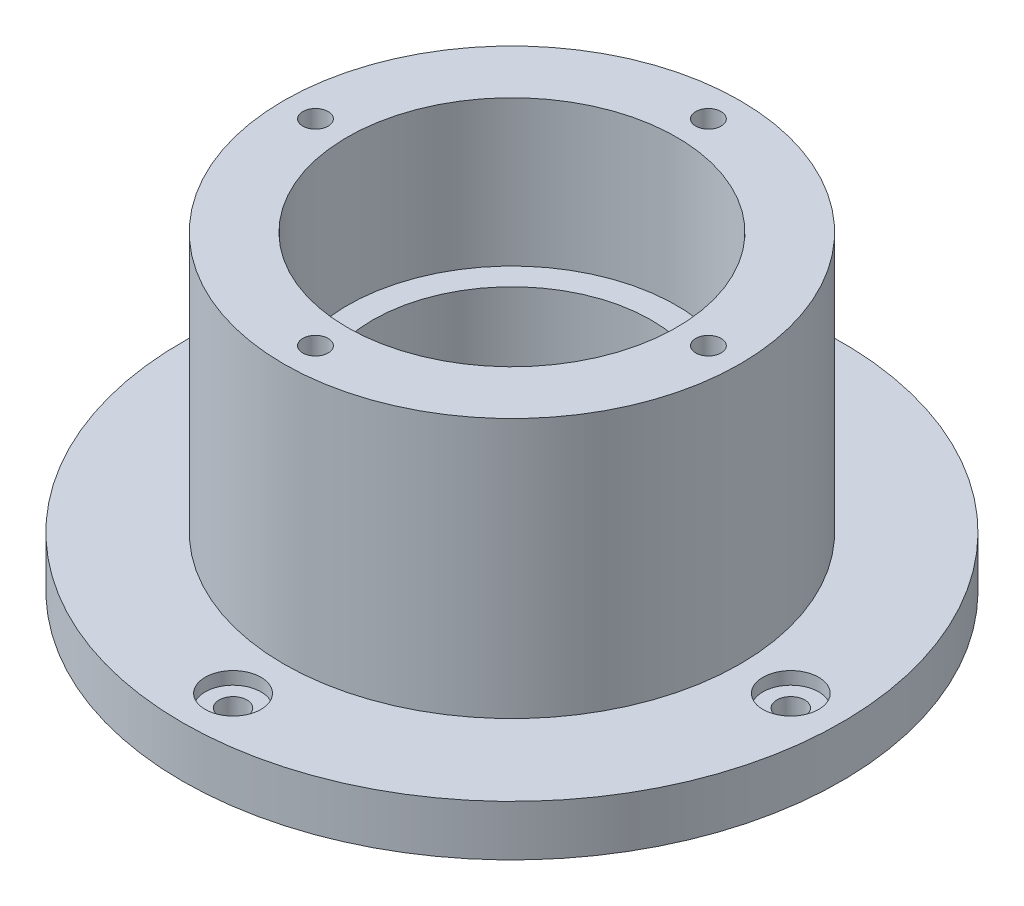
ISO-10303-21;
HEADER;
FILE_DESCRIPTION(('STEP AP214'),'2;1');
FILE_NAME('part.step','',(''),(''),'','','');
FILE_SCHEMA(('AUTOMOTIVE_DESIGN { 1 0 10303 214 1 1 1 1 }'));
ENDSEC;
DATA;
#1=APPLICATION_CONTEXT('core data for automotive mechanical design processes');
#2=APPLICATION_PROTOCOL_DEFINITION('international standard','automotive_design',2000,#1);
#3=PRODUCT_CONTEXT('',#1,'mechanical');
#4=PRODUCT('Part','Part','',(#3));
#5=PRODUCT_RELATED_PRODUCT_CATEGORY('part','',(#4));
#6=PRODUCT_DEFINITION_FORMATION('','',#4);
#7=PRODUCT_DEFINITION_CONTEXT('part definition',#1,'design');
#8=PRODUCT_DEFINITION('design','',#6,#7);
#9=PRODUCT_DEFINITION_SHAPE('','',#8);
#10=(LENGTH_UNIT() NAMED_UNIT(*) SI_UNIT(.MILLI.,.METRE.));
#11=(NAMED_UNIT(*) PLANE_ANGLE_UNIT() SI_UNIT($,.RADIAN.));
#12=(NAMED_UNIT(*) SI_UNIT($,.STERADIAN.) SOLID_ANGLE_UNIT());
#13=UNCERTAINTY_MEASURE_WITH_UNIT(LENGTH_MEASURE(1.E-05),#10,'distance_accuracy_value','');
#14=(GEOMETRIC_REPRESENTATION_CONTEXT(3) GLOBAL_UNCERTAINTY_ASSIGNED_CONTEXT((#13)) GLOBAL_UNIT_ASSIGNED_CONTEXT((#10,
#11,#12)) REPRESENTATION_CONTEXT('',''));
#15=CARTESIAN_POINT('',(0.,0.,0.));
#16=DIRECTION('',(0.,0.,1.));
#17=DIRECTION('',(1.,0.,0.));
#18=AXIS2_PLACEMENT_3D('',#15,#16,#17);
#19=CARTESIAN_POINT('',(0.,4.,0.));
#20=DIRECTION('',(0.,-1.,0.));
#21=DIRECTION('',(0.,0.,-1.));
#22=AXIS2_PLACEMENT_3D('',#19,#20,#21);
#23=CYLINDRICAL_SURFACE('',#22,26.);
#24=CARTESIAN_POINT('',(0.,4.,0.));
#25=DIRECTION('',(0.,1.,0.));
#26=DIRECTION('',(0.,0.,1.));
#27=AXIS2_PLACEMENT_3D('',#24,#25,#26);
#28=CIRCLE('',#27,26.);
#29=CARTESIAN_POINT('',(0.,4.,26.));
#30=VERTEX_POINT('',#29);
#31=EDGE_CURVE('E41',#30,#30,#28,.T.);
#32=ORIENTED_EDGE('',*,*,#31,.F.);
#33=EDGE_LOOP('',(#32));
#34=FACE_BOUND('',#33,.T.);
#35=CARTESIAN_POINT('',(0.,0.,0.));
#36=DIRECTION('',(0.,1.,0.));
#37=DIRECTION('',(0.,0.,1.));
#38=AXIS2_PLACEMENT_3D('',#35,#36,#37);
#39=CIRCLE('',#38,26.);
#40=CARTESIAN_POINT('',(0.,0.,26.));
#41=VERTEX_POINT('',#40);
#42=EDGE_CURVE('E46',#41,#41,#39,.T.);
#43=ORIENTED_EDGE('',*,*,#42,.T.);
#44=EDGE_LOOP('',(#43));
#45=FACE_BOUND('',#44,.T.);
#46=ADVANCED_FACE('F34',(#34,#45),#23,.T.);
#47=CARTESIAN_POINT('',(0.,4.,0.));
#48=DIRECTION('',(0.,1.,0.));
#49=DIRECTION('',(0.,0.,1.));
#50=AXIS2_PLACEMENT_3D('',#47,#48,#49);
#51=PLANE('',#50);
#52=CARTESIAN_POINT('',(-22.,4.,0.));
#53=DIRECTION('',(0.,1.,0.));
#54=DIRECTION('',(0.,0.,1.));
#55=AXIS2_PLACEMENT_3D('',#52,#53,#54);
#56=CIRCLE('',#55,2.2);
#57=CARTESIAN_POINT('',(-22.,4.,2.2));
#58=VERTEX_POINT('',#57);
#59=EDGE_CURVE('E120',#58,#58,#56,.T.);
#60=ORIENTED_EDGE('',*,*,#59,.F.);
#61=EDGE_LOOP('',(#60));
#62=FACE_BOUND('',#61,.T.);
#63=CARTESIAN_POINT('',(0.,4.,-22.));
#64=DIRECTION('',(0.,1.,0.));
#65=DIRECTION('',(0.,0.,1.));
#66=AXIS2_PLACEMENT_3D('',#63,#64,#65);
#67=CIRCLE('',#66,2.2);
#68=CARTESIAN_POINT('',(0.,4.,-19.8));
#69=VERTEX_POINT('',#68);
#70=EDGE_CURVE('E124',#69,#69,#67,.T.);
#71=ORIENTED_EDGE('',*,*,#70,.F.);
#72=EDGE_LOOP('',(#71));
#73=FACE_BOUND('',#72,.T.);
#74=CARTESIAN_POINT('',(22.,4.,1.53625178909098E-13));
#75=DIRECTION('',(0.,1.,0.));
#76=DIRECTION('',(0.,0.,1.));
#77=AXIS2_PLACEMENT_3D('',#74,#75,#76);
#78=CIRCLE('',#77,2.2);
#79=CARTESIAN_POINT('',(22.,4.,2.20000000000015));
#80=VERTEX_POINT('',#79);
#81=EDGE_CURVE('E74',#80,#80,#78,.T.);
#82=ORIENTED_EDGE('',*,*,#81,.F.);
#83=EDGE_LOOP('',(#82));
#84=FACE_BOUND('',#83,.T.);
#85=CARTESIAN_POINT('',(-2.30437768363647E-13,4.,22.));
#86=DIRECTION('',(0.,1.,0.));
#87=DIRECTION('',(0.,0.,1.));
#88=AXIS2_PLACEMENT_3D('',#85,#86,#87);
#89=CIRCLE('',#88,2.2);
#90=CARTESIAN_POINT('',(-2.30437768363647E-13,4.,24.2));
#91=VERTEX_POINT('',#90);
#92=EDGE_CURVE('E65',#91,#91,#89,.T.);
#93=ORIENTED_EDGE('',*,*,#92,.F.);
#94=EDGE_LOOP('',(#93));
#95=FACE_BOUND('',#94,.T.);
#96=CARTESIAN_POINT('',(0.,4.,0.));
#97=DIRECTION('',(0.,1.,0.));
#98=DIRECTION('',(0.,0.,1.));
#99=AXIS2_PLACEMENT_3D('',#96,#97,#98);
#100=CIRCLE('',#99,18.);
#101=CARTESIAN_POINT('',(0.,4.,18.));
#102=VERTEX_POINT('',#101);
#103=EDGE_CURVE('E11',#102,#102,#100,.T.);
#104=ORIENTED_EDGE('',*,*,#103,.F.);
#105=EDGE_LOOP('',(#104));
#106=FACE_BOUND('',#105,.T.);
#107=ORIENTED_EDGE('',*,*,#31,.T.);
#108=EDGE_LOOP('',(#107));
#109=FACE_BOUND('',#108,.T.);
#110=ADVANCED_FACE('F101',(#62,#73,#84,#95,#106,#109),#51,.T.);
#111=CARTESIAN_POINT('',(0.,0.,0.));
#112=DIRECTION('',(0.,1.,0.));
#113=DIRECTION('',(0.,0.,1.));
#114=AXIS2_PLACEMENT_3D('',#111,#112,#113);
#115=PLANE('',#114);
#116=CARTESIAN_POINT('',(0.,0.,0.));
#117=DIRECTION('',(0.,1.,0.));
#118=DIRECTION('',(0.,0.,1.));
#119=AXIS2_PLACEMENT_3D('',#116,#117,#118);
#120=CIRCLE('',#119,11.);
#121=CARTESIAN_POINT('',(0.,0.,11.));
#122=VERTEX_POINT('',#121);
#123=EDGE_CURVE('E145',#122,#122,#120,.T.);
#124=ORIENTED_EDGE('',*,*,#123,.T.);
#125=EDGE_LOOP('',(#124));
#126=FACE_BOUND('',#125,.T.);
#127=CARTESIAN_POINT('',(-22.,0.,0.));
#128=DIRECTION('',(0.,1.,0.));
#129=DIRECTION('',(0.,0.,1.));
#130=AXIS2_PLACEMENT_3D('',#127,#128,#129);
#131=CIRCLE('',#130,1.1);
#132=CARTESIAN_POINT('',(-22.,0.,1.1));
#133=VERTEX_POINT('',#132);
#134=EDGE_CURVE('E58',#133,#133,#131,.T.);
#135=ORIENTED_EDGE('',*,*,#134,.T.);
#136=EDGE_LOOP('',(#135));
#137=FACE_BOUND('',#136,.T.);
#138=CARTESIAN_POINT('',(0.,0.,-22.));
#139=DIRECTION('',(0.,1.,0.));
#140=DIRECTION('',(0.,0.,1.));
#141=AXIS2_PLACEMENT_3D('',#138,#139,#140);
#142=CIRCLE('',#141,1.1);
#143=CARTESIAN_POINT('',(0.,0.,-20.9));
#144=VERTEX_POINT('',#143);
#145=EDGE_CURVE('E148',#144,#144,#142,.T.);
#146=ORIENTED_EDGE('',*,*,#145,.T.);
#147=EDGE_LOOP('',(#146));
#148=FACE_BOUND('',#147,.T.);
#149=CARTESIAN_POINT('',(22.,0.,1.53625178909098E-13));
#150=DIRECTION('',(0.,1.,0.));
#151=DIRECTION('',(0.,0.,1.));
#152=AXIS2_PLACEMENT_3D('',#149,#150,#151);
#153=CIRCLE('',#152,1.1);
#154=CARTESIAN_POINT('',(22.,0.,1.10000000000015));
#155=VERTEX_POINT('',#154);
#156=EDGE_CURVE('E144',#155,#155,#153,.T.);
#157=ORIENTED_EDGE('',*,*,#156,.T.);
#158=EDGE_LOOP('',(#157));
#159=FACE_BOUND('',#158,.T.);
#160=CARTESIAN_POINT('',(-2.30437768363647E-13,0.,22.));
#161=DIRECTION('',(0.,1.,0.));
#162=DIRECTION('',(0.,0.,1.));
#163=AXIS2_PLACEMENT_3D('',#160,#161,#162);
#164=CIRCLE('',#163,1.1);
#165=CARTESIAN_POINT('',(-2.30437768363647E-13,0.,23.1));
#166=VERTEX_POINT('',#165);
#167=EDGE_CURVE('E141',#166,#166,#164,.T.);
#168=ORIENTED_EDGE('',*,*,#167,.T.);
#169=EDGE_LOOP('',(#168));
#170=FACE_BOUND('',#169,.T.);
#171=ORIENTED_EDGE('',*,*,#42,.F.);
#172=EDGE_LOOP('',(#171));
#173=FACE_BOUND('',#172,.T.);
#174=ADVANCED_FACE('F92',(#126,#137,#148,#159,#170,#173),#115,.F.);
#175=CARTESIAN_POINT('',(0.,24.5,0.));
#176=DIRECTION('',(0.,-1.,0.));
#177=DIRECTION('',(0.,0.,-1.));
#178=AXIS2_PLACEMENT_3D('',#175,#176,#177);
#179=CYLINDRICAL_SURFACE('',#178,18.);
#180=CARTESIAN_POINT('',(0.,24.5,0.));
#181=DIRECTION('',(0.,1.,0.));
#182=DIRECTION('',(0.,0.,1.));
#183=AXIS2_PLACEMENT_3D('',#180,#181,#182);
#184=CIRCLE('',#183,18.);
#185=CARTESIAN_POINT('',(0.,24.5,18.));
#186=VERTEX_POINT('',#185);
#187=EDGE_CURVE('E49',#186,#186,#184,.T.);
#188=ORIENTED_EDGE('',*,*,#187,.F.);
#189=EDGE_LOOP('',(#188));
#190=FACE_BOUND('',#189,.T.);
#191=ORIENTED_EDGE('',*,*,#103,.T.);
#192=EDGE_LOOP('',(#191));
#193=FACE_BOUND('',#192,.T.);
#194=ADVANCED_FACE('F90',(#190,#193),#179,.T.);
#195=CARTESIAN_POINT('',(0.,24.5,0.));
#196=DIRECTION('',(0.,1.,0.));
#197=DIRECTION('',(0.,0.,1.));
#198=AXIS2_PLACEMENT_3D('',#195,#196,#197);
#199=PLANE('',#198);
#200=CARTESIAN_POINT('',(-15.5,24.5,0.));
#201=DIRECTION('',(0.,1.,0.));
#202=DIRECTION('',(0.,0.,1.));
#203=AXIS2_PLACEMENT_3D('',#200,#201,#202);
#204=CIRCLE('',#203,1.);
#205=CARTESIAN_POINT('',(-15.5,24.5,1.));
#206=VERTEX_POINT('',#205);
#207=EDGE_CURVE('E177',#206,#206,#204,.T.);
#208=ORIENTED_EDGE('',*,*,#207,.F.);
#209=EDGE_LOOP('',(#208));
#210=FACE_BOUND('',#209,.T.);
#211=CARTESIAN_POINT('',(0.,24.5,-15.5));
#212=DIRECTION('',(0.,1.,0.));
#213=DIRECTION('',(0.,0.,1.));
#214=AXIS2_PLACEMENT_3D('',#211,#212,#213);
#215=CIRCLE('',#214,1.);
#216=CARTESIAN_POINT('',(0.,24.5,-14.5));
#217=VERTEX_POINT('',#216);
#218=EDGE_CURVE('E171',#217,#217,#215,.T.);
#219=ORIENTED_EDGE('',*,*,#218,.F.);
#220=EDGE_LOOP('',(#219));
#221=FACE_BOUND('',#220,.T.);
#222=CARTESIAN_POINT('',(15.5,24.5,1.08235921504137E-13));
#223=DIRECTION('',(0.,1.,0.));
#224=DIRECTION('',(0.,0.,1.));
#225=AXIS2_PLACEMENT_3D('',#222,#223,#224);
#226=CIRCLE('',#225,1.);
#227=CARTESIAN_POINT('',(15.5,24.5,1.00000000000011));
#228=VERTEX_POINT('',#227);
#229=EDGE_CURVE('E165',#228,#228,#226,.T.);
#230=ORIENTED_EDGE('',*,*,#229,.F.);
#231=EDGE_LOOP('',(#230));
#232=FACE_BOUND('',#231,.T.);
#233=CARTESIAN_POINT('',(-1.62353882256206E-13,24.5,15.5));
#234=DIRECTION('',(0.,1.,0.));
#235=DIRECTION('',(0.,0.,1.));
#236=AXIS2_PLACEMENT_3D('',#233,#234,#235);
#237=CIRCLE('',#236,1.);
#238=CARTESIAN_POINT('',(-1.62353882256206E-13,24.5,16.5));
#239=VERTEX_POINT('',#238);
#240=EDGE_CURVE('E159',#239,#239,#237,.T.);
#241=ORIENTED_EDGE('',*,*,#240,.F.);
#242=EDGE_LOOP('',(#241));
#243=FACE_BOUND('',#242,.T.);
#244=CARTESIAN_POINT('',(0.,24.5,0.));
#245=DIRECTION('',(0.,1.,0.));
#246=DIRECTION('',(0.,0.,1.));
#247=AXIS2_PLACEMENT_3D('',#244,#245,#246);
#248=CIRCLE('',#247,13.);
#249=CARTESIAN_POINT('',(0.,24.5,13.));
#250=VERTEX_POINT('',#249);
#251=EDGE_CURVE('E78',#250,#250,#248,.T.);
#252=ORIENTED_EDGE('',*,*,#251,.F.);
#253=EDGE_LOOP('',(#252));
#254=FACE_BOUND('',#253,.T.);
#255=ORIENTED_EDGE('',*,*,#187,.T.);
#256=EDGE_LOOP('',(#255));
#257=FACE_BOUND('',#256,.T.);
#258=ADVANCED_FACE('F88',(#210,#221,#232,#243,#254,#257),#199,.T.);
#259=CARTESIAN_POINT('',(0.,-36.7695526217005,0.));
#260=DIRECTION('',(0.,1.,0.));
#261=DIRECTION('',(0.,0.,1.));
#262=AXIS2_PLACEMENT_3D('',#259,#260,#261);
#263=CYLINDRICAL_SURFACE('',#262,13.);
#264=CARTESIAN_POINT('',(0.,13.,0.));
#265=DIRECTION('',(0.,1.,0.));
#266=DIRECTION('',(0.,0.,1.));
#267=AXIS2_PLACEMENT_3D('',#264,#265,#266);
#268=CIRCLE('',#267,13.);
#269=CARTESIAN_POINT('',(0.,13.,13.));
#270=VERTEX_POINT('',#269);
#271=EDGE_CURVE('E80',#270,#270,#268,.F.);
#272=CARTESIAN_POINT('',(0.,13.,13.));
#273=CARTESIAN_POINT('',(0.,13.1197916666667,13.));
#274=CARTESIAN_POINT('',(0.,13.2395833333333,13.));
#275=CARTESIAN_POINT('',(0.,13.4791666666667,13.));
#276=CARTESIAN_POINT('',(0.,13.5989583333333,13.));
#277=CARTESIAN_POINT('',(0.,13.8385416666667,13.));
#278=CARTESIAN_POINT('',(0.,13.9583333333333,13.));
#279=CARTESIAN_POINT('',(0.,14.1979166666667,13.));
#280=CARTESIAN_POINT('',(0.,14.3177083333333,13.));
#281=CARTESIAN_POINT('',(0.,14.5572916666667,13.));
#282=CARTESIAN_POINT('',(0.,14.6770833333333,13.));
#283=CARTESIAN_POINT('',(0.,14.9166666666667,13.));
#284=CARTESIAN_POINT('',(0.,15.0364583333333,13.));
#285=CARTESIAN_POINT('',(0.,15.2760416666667,13.));
#286=CARTESIAN_POINT('',(0.,15.3958333333333,13.));
#287=CARTESIAN_POINT('',(0.,15.6354166666667,13.));
#288=CARTESIAN_POINT('',(0.,15.7552083333333,13.));
#289=CARTESIAN_POINT('',(0.,15.9947916666667,13.));
#290=CARTESIAN_POINT('',(0.,16.1145833333333,13.));
#291=CARTESIAN_POINT('',(0.,16.3541666666667,13.));
#292=CARTESIAN_POINT('',(0.,16.4739583333333,13.));
#293=CARTESIAN_POINT('',(0.,16.7135416666667,13.));
#294=CARTESIAN_POINT('',(0.,16.8333333333333,13.));
#295=CARTESIAN_POINT('',(0.,17.0729166666667,13.));
#296=CARTESIAN_POINT('',(0.,17.1927083333333,13.));
#297=CARTESIAN_POINT('',(0.,17.4322916666667,13.));
#298=CARTESIAN_POINT('',(0.,17.5520833333333,13.));
#299=CARTESIAN_POINT('',(0.,17.7916666666667,13.));
#300=CARTESIAN_POINT('',(0.,17.9114583333333,13.));
#301=CARTESIAN_POINT('',(0.,18.1510416666667,13.));
#302=CARTESIAN_POINT('',(0.,18.2708333333333,13.));
#303=CARTESIAN_POINT('',(0.,18.5104166666667,13.));
#304=CARTESIAN_POINT('',(0.,18.6302083333333,13.));
#305=CARTESIAN_POINT('',(0.,18.8697916666667,13.));
#306=CARTESIAN_POINT('',(0.,18.9895833333333,13.));
#307=CARTESIAN_POINT('',(0.,19.2291666666667,13.));
#308=CARTESIAN_POINT('',(0.,19.3489583333333,13.));
#309=CARTESIAN_POINT('',(0.,19.5885416666667,13.));
#310=CARTESIAN_POINT('',(0.,19.7083333333333,13.));
#311=CARTESIAN_POINT('',(0.,19.9479166666667,13.));
#312=CARTESIAN_POINT('',(0.,20.0677083333333,13.));
#313=CARTESIAN_POINT('',(0.,20.3072916666667,13.));
#314=CARTESIAN_POINT('',(0.,20.4270833333333,13.));
#315=CARTESIAN_POINT('',(0.,20.6666666666667,13.));
#316=CARTESIAN_POINT('',(0.,20.7864583333333,13.));
#317=CARTESIAN_POINT('',(0.,21.0260416666667,13.));
#318=CARTESIAN_POINT('',(0.,21.1458333333333,13.));
#319=CARTESIAN_POINT('',(0.,21.3854166666667,13.));
#320=CARTESIAN_POINT('',(0.,21.5052083333333,13.));
#321=CARTESIAN_POINT('',(0.,21.7447916666667,13.));
#322=CARTESIAN_POINT('',(0.,21.8645833333333,13.));
#323=CARTESIAN_POINT('',(0.,22.1041666666667,13.));
#324=CARTESIAN_POINT('',(0.,22.2239583333333,13.));
#325=CARTESIAN_POINT('',(0.,22.4635416666667,13.));
#326=CARTESIAN_POINT('',(0.,22.5833333333333,13.));
#327=CARTESIAN_POINT('',(0.,22.8229166666667,13.));
#328=CARTESIAN_POINT('',(0.,22.9427083333333,13.));
#329=CARTESIAN_POINT('',(0.,23.1822916666667,13.));
#330=CARTESIAN_POINT('',(0.,23.3020833333333,13.));
#331=CARTESIAN_POINT('',(0.,23.5416666666667,13.));
#332=CARTESIAN_POINT('',(0.,23.6614583333333,13.));
#333=CARTESIAN_POINT('',(0.,23.9010416666667,13.));
#334=CARTESIAN_POINT('',(0.,24.0208333333333,13.));
#335=CARTESIAN_POINT('',(0.,24.2604166666667,13.));
#336=CARTESIAN_POINT('',(0.,24.3802083333333,13.));
#337=CARTESIAN_POINT('',(0.,24.5,13.));
#338=B_SPLINE_CURVE_WITH_KNOTS('',3,(#272,#273,#274,#275,#276,#277,#278,#279,#280,#281,#282,
#283,#284,#285,#286,#287,#288,#289,#290,#291,#292,#293,#294,#295,#296,#297,#298,#299,#300,#301,
#302,#303,#304,#305,#306,#307,#308,#309,#310,#311,#312,#313,#314,#315,#316,#317,#318,#319,#320,
#321,#322,#323,#324,#325,#326,#327,#328,#329,#330,#331,#332,#333,#334,#335,#336,#337),
.UNSPECIFIED.,.F.,.F.,(4,2,2,2,2,2,2,2,2,2,2,2,2,2,2,2,2,2,2,2,2,2,2,2,2,2,2,2,2,2,2,2,4),(0.,
0.359375000000002,0.718749999999997,1.078125,1.4375,1.796875,2.15625,2.515625,2.875,3.234375,
3.59375,3.953125,4.3125,4.671875,5.03125,5.390625,5.75,6.109375,6.46875,6.828125,7.1875,
7.54687499999999,7.90625,8.265625,8.62499999999999,8.984375,9.34375,9.70312499999999,10.0625,
10.421875,10.78125,11.140625,11.5),.UNSPECIFIED.);
#339=EDGE_CURVE('BSEAM98',#270,#250,#338,.T.);
#340=ORIENTED_EDGE('',*,*,#271,.T.);
#341=ORIENTED_EDGE('',*,*,#251,.T.);
#342=ORIENTED_EDGE('',*,*,#339,.T.);
#343=ORIENTED_EDGE('',*,*,#339,.F.);
#344=EDGE_LOOP('',(#340,#342,#341,#343));
#345=FACE_BOUND('',#344,.T.);
#346=ADVANCED_FACE('F98',(#345),#263,.F.);
#347=CARTESIAN_POINT('',(0.,13.,0.));
#348=DIRECTION('',(0.,1.,0.));
#349=DIRECTION('',(0.,0.,1.));
#350=AXIS2_PLACEMENT_3D('',#347,#348,#349);
#351=PLANE('',#350);
#352=CARTESIAN_POINT('',(0.,13.,0.));
#353=DIRECTION('',(0.,1.,0.));
#354=DIRECTION('',(0.,0.,1.));
#355=AXIS2_PLACEMENT_3D('',#352,#353,#354);
#356=CIRCLE('',#355,11.);
#357=CARTESIAN_POINT('',(0.,13.,11.));
#358=VERTEX_POINT('',#357);
#359=EDGE_CURVE('E153',#358,#358,#356,.T.);
#360=ORIENTED_EDGE('',*,*,#359,.F.);
#361=EDGE_LOOP('',(#360));
#362=FACE_BOUND('',#361,.T.);
#363=ORIENTED_EDGE('',*,*,#271,.F.);
#364=EDGE_LOOP('',(#363));
#365=FACE_BOUND('',#364,.T.);
#366=ADVANCED_FACE('F201',(#362,#365),#351,.T.);
#367=CARTESIAN_POINT('',(-2.30437768363647E-13,3.,22.));
#368=DIRECTION('',(0.,1.,0.));
#369=DIRECTION('',(0.,0.,1.));
#370=AXIS2_PLACEMENT_3D('',#367,#368,#369);
#371=CYLINDRICAL_SURFACE('',#370,2.2);
#372=CARTESIAN_POINT('',(-2.30437768363647E-13,3.,22.));
#373=DIRECTION('',(0.,1.,0.));
#374=DIRECTION('',(0.,0.,1.));
#375=AXIS2_PLACEMENT_3D('',#372,#373,#374);
#376=CIRCLE('',#375,2.2);
#377=CARTESIAN_POINT('',(-2.30437768363647E-13,3.,24.2));
#378=VERTEX_POINT('',#377);
#379=EDGE_CURVE('E69',#378,#378,#376,.T.);
#380=ORIENTED_EDGE('',*,*,#379,.F.);
#381=EDGE_LOOP('',(#380));
#382=FACE_BOUND('',#381,.T.);
#383=ORIENTED_EDGE('',*,*,#92,.T.);
#384=EDGE_LOOP('',(#383));
#385=FACE_BOUND('',#384,.T.);
#386=ADVANCED_FACE('F206',(#382,#385),#371,.F.);
#387=CARTESIAN_POINT('',(-2.30437768363647E-13,3.,22.));
#388=DIRECTION('',(0.,1.,0.));
#389=DIRECTION('',(0.,0.,1.));
#390=AXIS2_PLACEMENT_3D('',#387,#388,#389);
#391=PLANE('',#390);
#392=CARTESIAN_POINT('',(-2.30437768363647E-13,3.,22.));
#393=DIRECTION('',(0.,1.,0.));
#394=DIRECTION('',(0.,0.,1.));
#395=AXIS2_PLACEMENT_3D('',#392,#393,#394);
#396=CIRCLE('',#395,1.1);
#397=CARTESIAN_POINT('',(-2.30437768363647E-13,3.,23.1));
#398=VERTEX_POINT('',#397);
#399=EDGE_CURVE('E37',#398,#398,#396,.T.);
#400=ORIENTED_EDGE('',*,*,#399,.F.);
#401=EDGE_LOOP('',(#400));
#402=FACE_BOUND('',#401,.T.);
#403=ORIENTED_EDGE('',*,*,#379,.T.);
#404=EDGE_LOOP('',(#403));
#405=FACE_BOUND('',#404,.T.);
#406=ADVANCED_FACE('F212',(#402,#405),#391,.T.);
#407=CARTESIAN_POINT('',(22.,3.,1.53625178909098E-13));
#408=DIRECTION('',(0.,1.,0.));
#409=DIRECTION('',(0.,0.,1.));
#410=AXIS2_PLACEMENT_3D('',#407,#408,#409);
#411=CYLINDRICAL_SURFACE('',#410,2.2);
#412=CARTESIAN_POINT('',(22.,3.,1.53625178909098E-13));
#413=DIRECTION('',(0.,1.,0.));
#414=DIRECTION('',(0.,0.,1.));
#415=AXIS2_PLACEMENT_3D('',#412,#413,#414);
#416=CIRCLE('',#415,2.2);
#417=CARTESIAN_POINT('',(22.,3.,2.20000000000015));
#418=VERTEX_POINT('',#417);
#419=EDGE_CURVE('E130',#418,#418,#416,.T.);
#420=ORIENTED_EDGE('',*,*,#419,.F.);
#421=EDGE_LOOP('',(#420));
#422=FACE_BOUND('',#421,.T.);
#423=ORIENTED_EDGE('',*,*,#81,.T.);
#424=EDGE_LOOP('',(#423));
#425=FACE_BOUND('',#424,.T.);
#426=ADVANCED_FACE('F216',(#422,#425),#411,.F.);
#427=CARTESIAN_POINT('',(22.,3.,1.53625178909098E-13));
#428=DIRECTION('',(0.,1.,0.));
#429=DIRECTION('',(0.,0.,1.));
#430=AXIS2_PLACEMENT_3D('',#427,#428,#429);
#431=PLANE('',#430);
#432=CARTESIAN_POINT('',(22.,3.,1.53625178909098E-13));
#433=DIRECTION('',(0.,1.,0.));
#434=DIRECTION('',(0.,0.,1.));
#435=AXIS2_PLACEMENT_3D('',#432,#433,#434);
#436=CIRCLE('',#435,1.1);
#437=CARTESIAN_POINT('',(22.,3.,1.10000000000015));
#438=VERTEX_POINT('',#437);
#439=EDGE_CURVE('E60',#438,#438,#436,.T.);
#440=ORIENTED_EDGE('',*,*,#439,.F.);
#441=EDGE_LOOP('',(#440));
#442=FACE_BOUND('',#441,.T.);
#443=ORIENTED_EDGE('',*,*,#419,.T.);
#444=EDGE_LOOP('',(#443));
#445=FACE_BOUND('',#444,.T.);
#446=ADVANCED_FACE('F220',(#442,#445),#431,.T.);
#447=CARTESIAN_POINT('',(0.,3.,-22.));
#448=DIRECTION('',(0.,1.,0.));
#449=DIRECTION('',(0.,0.,1.));
#450=AXIS2_PLACEMENT_3D('',#447,#448,#449);
#451=CYLINDRICAL_SURFACE('',#450,2.2);
#452=CARTESIAN_POINT('',(0.,3.,-22.));
#453=DIRECTION('',(0.,1.,0.));
#454=DIRECTION('',(0.,0.,1.));
#455=AXIS2_PLACEMENT_3D('',#452,#453,#454);
#456=CIRCLE('',#455,2.2);
#457=CARTESIAN_POINT('',(0.,3.,-19.8));
#458=VERTEX_POINT('',#457);
#459=EDGE_CURVE('E135',#458,#458,#456,.T.);
#460=ORIENTED_EDGE('',*,*,#459,.F.);
#461=EDGE_LOOP('',(#460));
#462=FACE_BOUND('',#461,.T.);
#463=ORIENTED_EDGE('',*,*,#70,.T.);
#464=EDGE_LOOP('',(#463));
#465=FACE_BOUND('',#464,.T.);
#466=ADVANCED_FACE('F224',(#462,#465),#451,.F.);
#467=CARTESIAN_POINT('',(0.,3.,-22.));
#468=DIRECTION('',(0.,1.,0.));
#469=DIRECTION('',(0.,0.,1.));
#470=AXIS2_PLACEMENT_3D('',#467,#468,#469);
#471=PLANE('',#470);
#472=CARTESIAN_POINT('',(0.,3.,-22.));
#473=DIRECTION('',(0.,1.,0.));
#474=DIRECTION('',(0.,0.,1.));
#475=AXIS2_PLACEMENT_3D('',#472,#473,#474);
#476=CIRCLE('',#475,1.1);
#477=CARTESIAN_POINT('',(0.,3.,-20.9));
#478=VERTEX_POINT('',#477);
#479=EDGE_CURVE('E57',#478,#478,#476,.T.);
#480=ORIENTED_EDGE('',*,*,#479,.F.);
#481=EDGE_LOOP('',(#480));
#482=FACE_BOUND('',#481,.T.);
#483=ORIENTED_EDGE('',*,*,#459,.T.);
#484=EDGE_LOOP('',(#483));
#485=FACE_BOUND('',#484,.T.);
#486=ADVANCED_FACE('F228',(#482,#485),#471,.T.);
#487=CARTESIAN_POINT('',(-22.,3.,0.));
#488=DIRECTION('',(0.,1.,0.));
#489=DIRECTION('',(0.,0.,1.));
#490=AXIS2_PLACEMENT_3D('',#487,#488,#489);
#491=CYLINDRICAL_SURFACE('',#490,2.2);
#492=CARTESIAN_POINT('',(-22.,3.,0.));
#493=DIRECTION('',(0.,1.,0.));
#494=DIRECTION('',(0.,0.,1.));
#495=AXIS2_PLACEMENT_3D('',#492,#493,#494);
#496=CIRCLE('',#495,2.2);
#497=CARTESIAN_POINT('',(-22.,3.,2.2));
#498=VERTEX_POINT('',#497);
#499=EDGE_CURVE('E81',#498,#498,#496,.T.);
#500=ORIENTED_EDGE('',*,*,#499,.F.);
#501=EDGE_LOOP('',(#500));
#502=FACE_BOUND('',#501,.T.);
#503=ORIENTED_EDGE('',*,*,#59,.T.);
#504=EDGE_LOOP('',(#503));
#505=FACE_BOUND('',#504,.T.);
#506=ADVANCED_FACE('F232',(#502,#505),#491,.F.);
#507=CARTESIAN_POINT('',(-22.,3.,0.));
#508=DIRECTION('',(0.,1.,0.));
#509=DIRECTION('',(0.,0.,1.));
#510=AXIS2_PLACEMENT_3D('',#507,#508,#509);
#511=PLANE('',#510);
#512=CARTESIAN_POINT('',(-22.,3.,0.));
#513=DIRECTION('',(0.,1.,0.));
#514=DIRECTION('',(0.,0.,1.));
#515=AXIS2_PLACEMENT_3D('',#512,#513,#514);
#516=CIRCLE('',#515,1.1);
#517=CARTESIAN_POINT('',(-22.,3.,1.1));
#518=VERTEX_POINT('',#517);
#519=EDGE_CURVE('E54',#518,#518,#516,.T.);
#520=ORIENTED_EDGE('',*,*,#519,.F.);
#521=EDGE_LOOP('',(#520));
#522=FACE_BOUND('',#521,.T.);
#523=ORIENTED_EDGE('',*,*,#499,.T.);
#524=EDGE_LOOP('',(#523));
#525=FACE_BOUND('',#524,.T.);
#526=ADVANCED_FACE('F236',(#522,#525),#511,.T.);
#527=CARTESIAN_POINT('',(-22.,0.,0.));
#528=DIRECTION('',(0.,1.,0.));
#529=DIRECTION('',(0.,0.,1.));
#530=AXIS2_PLACEMENT_3D('',#527,#528,#529);
#531=CYLINDRICAL_SURFACE('',#530,1.1);
#532=ORIENTED_EDGE('',*,*,#519,.T.);
#533=EDGE_LOOP('',(#532));
#534=FACE_BOUND('',#533,.T.);
#535=ORIENTED_EDGE('',*,*,#134,.F.);
#536=EDGE_LOOP('',(#535));
#537=FACE_BOUND('',#536,.T.);
#538=ADVANCED_FACE('F240',(#534,#537),#531,.F.);
#539=CARTESIAN_POINT('',(0.,0.,-22.));
#540=DIRECTION('',(0.,1.,0.));
#541=DIRECTION('',(0.,0.,1.));
#542=AXIS2_PLACEMENT_3D('',#539,#540,#541);
#543=CYLINDRICAL_SURFACE('',#542,1.1);
#544=ORIENTED_EDGE('',*,*,#479,.T.);
#545=EDGE_LOOP('',(#544));
#546=FACE_BOUND('',#545,.T.);
#547=ORIENTED_EDGE('',*,*,#145,.F.);
#548=EDGE_LOOP('',(#547));
#549=FACE_BOUND('',#548,.T.);
#550=ADVANCED_FACE('F249',(#546,#549),#543,.F.);
#551=CARTESIAN_POINT('',(22.,0.,1.53625178909098E-13));
#552=DIRECTION('',(0.,1.,0.));
#553=DIRECTION('',(0.,0.,1.));
#554=AXIS2_PLACEMENT_3D('',#551,#552,#553);
#555=CYLINDRICAL_SURFACE('',#554,1.1);
#556=ORIENTED_EDGE('',*,*,#439,.T.);
#557=EDGE_LOOP('',(#556));
#558=FACE_BOUND('',#557,.T.);
#559=ORIENTED_EDGE('',*,*,#156,.F.);
#560=EDGE_LOOP('',(#559));
#561=FACE_BOUND('',#560,.T.);
#562=ADVANCED_FACE('F246',(#558,#561),#555,.F.);
#563=CARTESIAN_POINT('',(-2.30437768363647E-13,0.,22.));
#564=DIRECTION('',(0.,1.,0.));
#565=DIRECTION('',(0.,0.,1.));
#566=AXIS2_PLACEMENT_3D('',#563,#564,#565);
#567=CYLINDRICAL_SURFACE('',#566,1.1);
#568=ORIENTED_EDGE('',*,*,#399,.T.);
#569=EDGE_LOOP('',(#568));
#570=FACE_BOUND('',#569,.T.);
#571=ORIENTED_EDGE('',*,*,#167,.F.);
#572=EDGE_LOOP('',(#571));
#573=FACE_BOUND('',#572,.T.);
#574=ADVANCED_FACE('F242',(#570,#573),#567,.F.);
#575=CARTESIAN_POINT('',(0.,0.,0.));
#576=DIRECTION('',(0.,1.,0.));
#577=DIRECTION('',(0.,0.,1.));
#578=AXIS2_PLACEMENT_3D('',#575,#576,#577);
#579=CYLINDRICAL_SURFACE('',#578,11.);
#580=CARTESIAN_POINT('',(0.,0.,11.));
#581=CARTESIAN_POINT('',(0.,0.135416666666666,11.));
#582=CARTESIAN_POINT('',(0.,0.270833333333333,11.));
#583=CARTESIAN_POINT('',(0.,0.541666666666667,11.));
#584=CARTESIAN_POINT('',(0.,0.677083333333333,11.));
#585=CARTESIAN_POINT('',(0.,0.947916666666667,11.));
#586=CARTESIAN_POINT('',(0.,1.08333333333333,11.));
#587=CARTESIAN_POINT('',(0.,1.35416666666667,11.));
#588=CARTESIAN_POINT('',(0.,1.48958333333333,11.));
#589=CARTESIAN_POINT('',(0.,1.76041666666667,11.));
#590=CARTESIAN_POINT('',(0.,1.89583333333333,11.));
#591=CARTESIAN_POINT('',(0.,2.16666666666667,11.));
#592=CARTESIAN_POINT('',(0.,2.30208333333333,11.));
#593=CARTESIAN_POINT('',(0.,2.57291666666667,11.));
#594=CARTESIAN_POINT('',(0.,2.70833333333333,11.));
#595=CARTESIAN_POINT('',(0.,2.97916666666667,11.));
#596=CARTESIAN_POINT('',(0.,3.11458333333333,11.));
#597=CARTESIAN_POINT('',(0.,3.38541666666667,11.));
#598=CARTESIAN_POINT('',(0.,3.52083333333333,11.));
#599=CARTESIAN_POINT('',(0.,3.79166666666667,11.));
#600=CARTESIAN_POINT('',(0.,3.92708333333333,11.));
#601=CARTESIAN_POINT('',(0.,4.19791666666667,11.));
#602=CARTESIAN_POINT('',(0.,4.33333333333333,11.));
#603=CARTESIAN_POINT('',(0.,4.60416666666667,11.));
#604=CARTESIAN_POINT('',(0.,4.73958333333333,11.));
#605=CARTESIAN_POINT('',(0.,5.01041666666667,11.));
#606=CARTESIAN_POINT('',(0.,5.14583333333333,11.));
#607=CARTESIAN_POINT('',(0.,5.41666666666667,11.));
#608=CARTESIAN_POINT('',(0.,5.55208333333333,11.));
#609=CARTESIAN_POINT('',(0.,5.82291666666667,11.));
#610=CARTESIAN_POINT('',(0.,5.95833333333333,11.));
#611=CARTESIAN_POINT('',(0.,6.22916666666667,11.));
#612=CARTESIAN_POINT('',(0.,6.36458333333333,11.));
#613=CARTESIAN_POINT('',(0.,6.63541666666667,11.));
#614=CARTESIAN_POINT('',(0.,6.77083333333333,11.));
#615=CARTESIAN_POINT('',(0.,7.04166666666667,11.));
#616=CARTESIAN_POINT('',(0.,7.17708333333333,11.));
#617=CARTESIAN_POINT('',(0.,7.44791666666667,11.));
#618=CARTESIAN_POINT('',(0.,7.58333333333333,11.));
#619=CARTESIAN_POINT('',(0.,7.85416666666667,11.));
#620=CARTESIAN_POINT('',(0.,7.98958333333333,11.));
#621=CARTESIAN_POINT('',(0.,8.26041666666667,11.));
#622=CARTESIAN_POINT('',(0.,8.39583333333333,11.));
#623=CARTESIAN_POINT('',(0.,8.66666666666667,11.));
#624=CARTESIAN_POINT('',(0.,8.80208333333333,11.));
#625=CARTESIAN_POINT('',(0.,9.07291666666667,11.));
#626=CARTESIAN_POINT('',(0.,9.20833333333333,11.));
#627=CARTESIAN_POINT('',(0.,9.47916666666667,11.));
#628=CARTESIAN_POINT('',(0.,9.61458333333333,11.));
#629=CARTESIAN_POINT('',(0.,9.88541666666667,11.));
#630=CARTESIAN_POINT('',(0.,10.0208333333333,11.));
#631=CARTESIAN_POINT('',(0.,10.2916666666667,11.));
#632=CARTESIAN_POINT('',(0.,10.4270833333333,11.));
#633=CARTESIAN_POINT('',(0.,10.6979166666667,11.));
#634=CARTESIAN_POINT('',(0.,10.8333333333333,11.));
#635=CARTESIAN_POINT('',(0.,11.1041666666667,11.));
#636=CARTESIAN_POINT('',(0.,11.2395833333333,11.));
#637=CARTESIAN_POINT('',(0.,11.5104166666667,11.));
#638=CARTESIAN_POINT('',(0.,11.6458333333333,11.));
#639=CARTESIAN_POINT('',(0.,11.9166666666667,11.));
#640=CARTESIAN_POINT('',(0.,12.0520833333333,11.));
#641=CARTESIAN_POINT('',(0.,12.3229166666667,11.));
#642=CARTESIAN_POINT('',(0.,12.4583333333333,11.));
#643=CARTESIAN_POINT('',(0.,12.7291666666667,11.));
#644=CARTESIAN_POINT('',(0.,12.8645833333333,11.));
#645=CARTESIAN_POINT('',(0.,13.,11.));
#646=B_SPLINE_CURVE_WITH_KNOTS('',3,(#580,#581,#582,#583,#584,#585,#586,#587,#588,#589,#590,
#591,#592,#593,#594,#595,#596,#597,#598,#599,#600,#601,#602,#603,#604,#605,#606,#607,#608,#609,
#610,#611,#612,#613,#614,#615,#616,#617,#618,#619,#620,#621,#622,#623,#624,#625,#626,#627,#628,
#629,#630,#631,#632,#633,#634,#635,#636,#637,#638,#639,#640,#641,#642,#643,#644,#645),
.UNSPECIFIED.,.F.,.F.,(4,2,2,2,2,2,2,2,2,2,2,2,2,2,2,2,2,2,2,2,2,2,2,2,2,2,2,2,2,2,2,2,4),(0.,
0.40625,0.8125,1.21875,1.625,2.03125,2.4375,2.84375,3.25,3.65625,4.0625,4.46875,4.875,5.28125,
5.6875,6.09375,6.5,6.90625,7.3125,7.71875,8.125,8.53125,8.9375,9.34375,9.75,10.15625,10.5625,
10.96875,11.375,11.78125,12.1875,12.59375,13.),.UNSPECIFIED.);
#647=EDGE_CURVE('BSEAM245',#122,#358,#646,.T.);
#648=ORIENTED_EDGE('',*,*,#123,.F.);
#649=ORIENTED_EDGE('',*,*,#359,.T.);
#650=ORIENTED_EDGE('',*,*,#647,.T.);
#651=ORIENTED_EDGE('',*,*,#647,.F.);
#652=EDGE_LOOP('',(#648,#650,#649,#651));
#653=FACE_BOUND('',#652,.T.);
#654=ADVANCED_FACE('F245',(#653),#579,.F.);
#655=CARTESIAN_POINT('',(-1.62353882256206E-13,19.5,15.5));
#656=DIRECTION('',(0.,1.,0.));
#657=DIRECTION('',(0.,0.,1.));
#658=AXIS2_PLACEMENT_3D('',#655,#656,#657);
#659=CYLINDRICAL_SURFACE('',#658,1.);
#660=CARTESIAN_POINT('',(-1.62353882256206E-13,19.5,15.5));
#661=DIRECTION('',(0.,1.,0.));
#662=DIRECTION('',(0.,0.,1.));
#663=AXIS2_PLACEMENT_3D('',#660,#661,#662);
#664=CIRCLE('',#663,1.);
#665=CARTESIAN_POINT('',(-1.62353882256206E-13,19.5,16.5));
#666=VERTEX_POINT('',#665);
#667=EDGE_CURVE('E162',#666,#666,#664,.T.);
#668=ORIENTED_EDGE('',*,*,#667,.F.);
#669=EDGE_LOOP('',(#668));
#670=FACE_BOUND('',#669,.T.);
#671=ORIENTED_EDGE('',*,*,#240,.T.);
#672=EDGE_LOOP('',(#671));
#673=FACE_BOUND('',#672,.T.);
#674=ADVANCED_FACE('F258',(#670,#673),#659,.F.);
#675=CARTESIAN_POINT('',(-1.62353882256206E-13,19.5,15.5));
#676=DIRECTION('',(0.,1.,0.));
#677=DIRECTION('',(0.,0.,1.));
#678=AXIS2_PLACEMENT_3D('',#675,#676,#677);
#679=PLANE('',#678);
#680=ORIENTED_EDGE('',*,*,#667,.T.);
#681=EDGE_LOOP('',(#680));
#682=FACE_BOUND('',#681,.T.);
#683=ADVANCED_FACE('F262',(#682),#679,.T.);
#684=CARTESIAN_POINT('',(15.5,19.5,1.08235921504137E-13));
#685=DIRECTION('',(0.,1.,0.));
#686=DIRECTION('',(0.,0.,1.));
#687=AXIS2_PLACEMENT_3D('',#684,#685,#686);
#688=CYLINDRICAL_SURFACE('',#687,1.);
#689=CARTESIAN_POINT('',(15.5,19.5,1.08235921504137E-13));
#690=DIRECTION('',(0.,1.,0.));
#691=DIRECTION('',(0.,0.,1.));
#692=AXIS2_PLACEMENT_3D('',#689,#690,#691);
#693=CIRCLE('',#692,1.);
#694=CARTESIAN_POINT('',(15.5,19.5,1.00000000000011));
#695=VERTEX_POINT('',#694);
#696=EDGE_CURVE('E168',#695,#695,#693,.T.);
#697=ORIENTED_EDGE('',*,*,#696,.F.);
#698=EDGE_LOOP('',(#697));
#699=FACE_BOUND('',#698,.T.);
#700=ORIENTED_EDGE('',*,*,#229,.T.);
#701=EDGE_LOOP('',(#700));
#702=FACE_BOUND('',#701,.T.);
#703=ADVANCED_FACE('F266',(#699,#702),#688,.F.);
#704=CARTESIAN_POINT('',(15.5,19.5,1.08235921504137E-13));
#705=DIRECTION('',(0.,1.,0.));
#706=DIRECTION('',(0.,0.,1.));
#707=AXIS2_PLACEMENT_3D('',#704,#705,#706);
#708=PLANE('',#707);
#709=ORIENTED_EDGE('',*,*,#696,.T.);
#710=EDGE_LOOP('',(#709));
#711=FACE_BOUND('',#710,.T.);
#712=ADVANCED_FACE('F270',(#711),#708,.T.);
#713=CARTESIAN_POINT('',(0.,19.5,-15.5));
#714=DIRECTION('',(0.,1.,0.));
#715=DIRECTION('',(0.,0.,1.));
#716=AXIS2_PLACEMENT_3D('',#713,#714,#715);
#717=CYLINDRICAL_SURFACE('',#716,1.);
#718=CARTESIAN_POINT('',(0.,19.5,-15.5));
#719=DIRECTION('',(0.,1.,0.));
#720=DIRECTION('',(0.,0.,1.));
#721=AXIS2_PLACEMENT_3D('',#718,#719,#720);
#722=CIRCLE('',#721,1.);
#723=CARTESIAN_POINT('',(0.,19.5,-14.5));
#724=VERTEX_POINT('',#723);
#725=EDGE_CURVE('E174',#724,#724,#722,.T.);
#726=ORIENTED_EDGE('',*,*,#725,.F.);
#727=EDGE_LOOP('',(#726));
#728=FACE_BOUND('',#727,.T.);
#729=ORIENTED_EDGE('',*,*,#218,.T.);
#730=EDGE_LOOP('',(#729));
#731=FACE_BOUND('',#730,.T.);
#732=ADVANCED_FACE('F274',(#728,#731),#717,.F.);
#733=CARTESIAN_POINT('',(0.,19.5,-15.5));
#734=DIRECTION('',(0.,1.,0.));
#735=DIRECTION('',(0.,0.,1.));
#736=AXIS2_PLACEMENT_3D('',#733,#734,#735);
#737=PLANE('',#736);
#738=ORIENTED_EDGE('',*,*,#725,.T.);
#739=EDGE_LOOP('',(#738));
#740=FACE_BOUND('',#739,.T.);
#741=ADVANCED_FACE('F188',(#740),#737,.T.);
#742=CARTESIAN_POINT('',(-15.5,19.5,0.));
#743=DIRECTION('',(0.,1.,0.));
#744=DIRECTION('',(0.,0.,1.));
#745=AXIS2_PLACEMENT_3D('',#742,#743,#744);
#746=CYLINDRICAL_SURFACE('',#745,1.);
#747=CARTESIAN_POINT('',(-15.5,19.5,0.));
#748=DIRECTION('',(0.,1.,0.));
#749=DIRECTION('',(0.,0.,1.));
#750=AXIS2_PLACEMENT_3D('',#747,#748,#749);
#751=CIRCLE('',#750,1.);
#752=CARTESIAN_POINT('',(-15.5,19.5,1.));
#753=VERTEX_POINT('',#752);
#754=EDGE_CURVE('E156',#753,#753,#751,.T.);
#755=ORIENTED_EDGE('',*,*,#754,.F.);
#756=EDGE_LOOP('',(#755));
#757=FACE_BOUND('',#756,.T.);
#758=ORIENTED_EDGE('',*,*,#207,.T.);
#759=EDGE_LOOP('',(#758));
#760=FACE_BOUND('',#759,.T.);
#761=ADVANCED_FACE('F185',(#757,#760),#746,.F.);
#762=CARTESIAN_POINT('',(-15.5,19.5,0.));
#763=DIRECTION('',(0.,1.,0.));
#764=DIRECTION('',(0.,0.,1.));
#765=AXIS2_PLACEMENT_3D('',#762,#763,#764);
#766=PLANE('',#765);
#767=ORIENTED_EDGE('',*,*,#754,.T.);
#768=EDGE_LOOP('',(#767));
#769=FACE_BOUND('',#768,.T.);
#770=ADVANCED_FACE('F183',(#769),#766,.T.);
#771=CLOSED_SHELL('',(#46,#110,#174,#194,#258,#346,#366,#386,#406,#426,#446,#466,#486,#506,#526,
#538,#550,#562,#574,#654,#674,#683,#703,#712,#732,#741,#761,#770));
#772=MANIFOLD_SOLID_BREP('B2',#771);
#773=ADVANCED_BREP_SHAPE_REPRESENTATION('',(#18,#772),#14);
#774=SHAPE_DEFINITION_REPRESENTATION(#9,#773);
ENDSEC;
END-ISO-10303-21;
